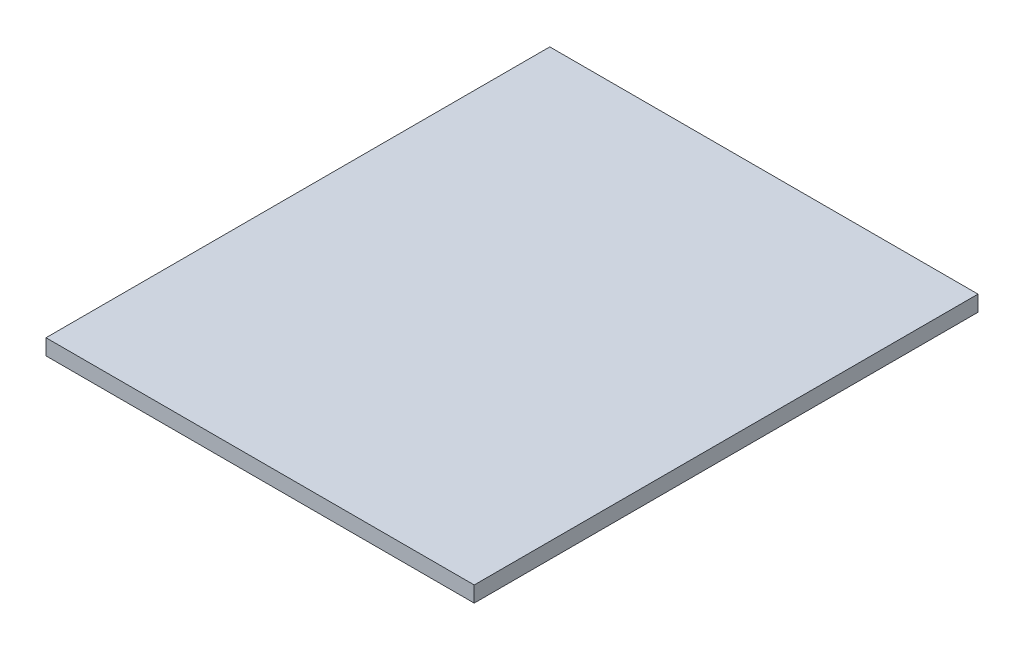
ISO-10303-21;
HEADER;
FILE_DESCRIPTION(('STEP AP214'),'2;1');
FILE_NAME('part.step','',(''),(''),'','','');
FILE_SCHEMA(('AUTOMOTIVE_DESIGN { 1 0 10303 214 1 1 1 1 }'));
ENDSEC;
DATA;
#1=APPLICATION_CONTEXT('core data for automotive mechanical design processes');
#2=APPLICATION_PROTOCOL_DEFINITION('international standard','automotive_design',2000,#1);
#3=PRODUCT_CONTEXT('',#1,'mechanical');
#4=PRODUCT('Part','Part','',(#3));
#5=PRODUCT_RELATED_PRODUCT_CATEGORY('part','',(#4));
#6=PRODUCT_DEFINITION_FORMATION('','',#4);
#7=PRODUCT_DEFINITION_CONTEXT('part definition',#1,'design');
#8=PRODUCT_DEFINITION('design','',#6,#7);
#9=PRODUCT_DEFINITION_SHAPE('','',#8);
#10=(LENGTH_UNIT() NAMED_UNIT(*) SI_UNIT(.MILLI.,.METRE.));
#11=(NAMED_UNIT(*) PLANE_ANGLE_UNIT() SI_UNIT($,.RADIAN.));
#12=(NAMED_UNIT(*) SI_UNIT($,.STERADIAN.) SOLID_ANGLE_UNIT());
#13=UNCERTAINTY_MEASURE_WITH_UNIT(LENGTH_MEASURE(1.E-05),#10,'distance_accuracy_value','');
#14=(GEOMETRIC_REPRESENTATION_CONTEXT(3) GLOBAL_UNCERTAINTY_ASSIGNED_CONTEXT((#13)) GLOBAL_UNIT_ASSIGNED_CONTEXT((#10,
#11,#12)) REPRESENTATION_CONTEXT('',''));
#15=CARTESIAN_POINT('',(0.,0.,0.));
#16=DIRECTION('',(0.,0.,1.));
#17=DIRECTION('',(1.,0.,0.));
#18=AXIS2_PLACEMENT_3D('',#15,#16,#17);
#19=CARTESIAN_POINT('',(43.18,3.175,50.8));
#20=DIRECTION('',(-1.,0.,0.));
#21=DIRECTION('',(0.,0.,1.));
#22=AXIS2_PLACEMENT_3D('',#19,#20,#21);
#23=PLANE('',#22);
#24=DIRECTION('',(0.,0.,-1.));
#25=VECTOR('',#24,1.);
#26=CARTESIAN_POINT('',(43.18,0.,50.8));
#27=LINE('',#26,#25);
#28=CARTESIAN_POINT('',(43.18,0.,50.8));
#29=VERTEX_POINT('',#28);
#30=CARTESIAN_POINT('',(43.18,0.,-50.8));
#31=VERTEX_POINT('',#30);
#32=EDGE_CURVE('E98',#29,#31,#27,.T.);
#33=ORIENTED_EDGE('',*,*,#32,.T.);
#34=DIRECTION('',(0.,-1.,0.));
#35=VECTOR('',#34,1.);
#36=CARTESIAN_POINT('',(43.18,3.175,-50.8));
#37=LINE('',#36,#35);
#38=CARTESIAN_POINT('',(43.18,3.175,-50.8));
#39=VERTEX_POINT('',#38);
#40=EDGE_CURVE('E11',#39,#31,#37,.T.);
#41=ORIENTED_EDGE('',*,*,#40,.F.);
#42=DIRECTION('',(0.,0.,-1.));
#43=VECTOR('',#42,1.);
#44=CARTESIAN_POINT('',(43.18,3.175,50.8));
#45=LINE('',#44,#43);
#46=CARTESIAN_POINT('',(43.18,3.175,50.8));
#47=VERTEX_POINT('',#46);
#48=EDGE_CURVE('E86',#47,#39,#45,.T.);
#49=ORIENTED_EDGE('',*,*,#48,.F.);
#50=DIRECTION('',(0.,-1.,0.));
#51=VECTOR('',#50,1.);
#52=CARTESIAN_POINT('',(43.18,3.175,50.8));
#53=LINE('',#52,#51);
#54=EDGE_CURVE('E94',#47,#29,#53,.T.);
#55=ORIENTED_EDGE('',*,*,#54,.T.);
#56=EDGE_LOOP('',(#33,#41,#49,#55));
#57=FACE_BOUND('',#56,.T.);
#58=ADVANCED_FACE('F35',(#57),#23,.F.);
#59=CARTESIAN_POINT('',(-43.18,3.175,-50.8));
#60=DIRECTION('',(0.,0.,1.));
#61=DIRECTION('',(1.,0.,0.));
#62=AXIS2_PLACEMENT_3D('',#59,#60,#61);
#63=PLANE('',#62);
#64=DIRECTION('',(-1.,0.,0.));
#65=VECTOR('',#64,1.);
#66=CARTESIAN_POINT('',(-43.18,0.,-50.8));
#67=LINE('',#66,#65);
#68=CARTESIAN_POINT('',(-43.18,0.,-50.8));
#69=VERTEX_POINT('',#68);
#70=EDGE_CURVE('E90',#31,#69,#67,.T.);
#71=ORIENTED_EDGE('',*,*,#70,.T.);
#72=DIRECTION('',(0.,-1.,0.));
#73=VECTOR('',#72,1.);
#74=CARTESIAN_POINT('',(-43.18,3.175,-50.8));
#75=LINE('',#74,#73);
#76=CARTESIAN_POINT('',(-43.18,3.175,-50.8));
#77=VERTEX_POINT('',#76);
#78=EDGE_CURVE('E43',#77,#69,#75,.T.);
#79=ORIENTED_EDGE('',*,*,#78,.F.);
#80=DIRECTION('',(-1.,0.,0.));
#81=VECTOR('',#80,1.);
#82=CARTESIAN_POINT('',(-43.18,3.175,-50.8));
#83=LINE('',#82,#81);
#84=EDGE_CURVE('E81',#39,#77,#83,.T.);
#85=ORIENTED_EDGE('',*,*,#84,.F.);
#86=ORIENTED_EDGE('',*,*,#40,.T.);
#87=EDGE_LOOP('',(#71,#79,#85,#86));
#88=FACE_BOUND('',#87,.T.);
#89=ADVANCED_FACE('F89',(#88),#63,.F.);
#90=CARTESIAN_POINT('',(-43.18,3.175,50.8));
#91=DIRECTION('',(1.,0.,0.));
#92=DIRECTION('',(0.,0.,-1.));
#93=AXIS2_PLACEMENT_3D('',#90,#91,#92);
#94=PLANE('',#93);
#95=DIRECTION('',(0.,0.,1.));
#96=VECTOR('',#95,1.);
#97=CARTESIAN_POINT('',(-43.18,0.,50.8));
#98=LINE('',#97,#96);
#99=CARTESIAN_POINT('',(-43.18,0.,50.8));
#100=VERTEX_POINT('',#99);
#101=EDGE_CURVE('E68',#69,#100,#98,.T.);
#102=ORIENTED_EDGE('',*,*,#101,.T.);
#103=DIRECTION('',(0.,-1.,0.));
#104=VECTOR('',#103,1.);
#105=CARTESIAN_POINT('',(-43.18,3.175,50.8));
#106=LINE('',#105,#104);
#107=CARTESIAN_POINT('',(-43.18,3.175,50.8));
#108=VERTEX_POINT('',#107);
#109=EDGE_CURVE('E91',#108,#100,#106,.T.);
#110=ORIENTED_EDGE('',*,*,#109,.F.);
#111=DIRECTION('',(0.,0.,1.));
#112=VECTOR('',#111,1.);
#113=CARTESIAN_POINT('',(-43.18,3.175,50.8));
#114=LINE('',#113,#112);
#115=EDGE_CURVE('E84',#77,#108,#114,.T.);
#116=ORIENTED_EDGE('',*,*,#115,.F.);
#117=ORIENTED_EDGE('',*,*,#78,.T.);
#118=EDGE_LOOP('',(#102,#110,#116,#117));
#119=FACE_BOUND('',#118,.T.);
#120=ADVANCED_FACE('F92',(#119),#94,.F.);
#121=CARTESIAN_POINT('',(-43.18,3.175,50.8));
#122=DIRECTION('',(0.,0.,-1.));
#123=DIRECTION('',(-1.,0.,0.));
#124=AXIS2_PLACEMENT_3D('',#121,#122,#123);
#125=PLANE('',#124);
#126=DIRECTION('',(1.,0.,0.));
#127=VECTOR('',#126,1.);
#128=CARTESIAN_POINT('',(-43.18,0.,50.8));
#129=LINE('',#128,#127);
#130=EDGE_CURVE('E74',#100,#29,#129,.T.);
#131=ORIENTED_EDGE('',*,*,#130,.T.);
#132=ORIENTED_EDGE('',*,*,#54,.F.);
#133=DIRECTION('',(1.,0.,0.));
#134=VECTOR('',#133,1.);
#135=CARTESIAN_POINT('',(-43.18,3.175,50.8));
#136=LINE('',#135,#134);
#137=EDGE_CURVE('E51',#108,#47,#136,.T.);
#138=ORIENTED_EDGE('',*,*,#137,.F.);
#139=ORIENTED_EDGE('',*,*,#109,.T.);
#140=EDGE_LOOP('',(#131,#132,#138,#139));
#141=FACE_BOUND('',#140,.T.);
#142=ADVANCED_FACE('F105',(#141),#125,.F.);
#143=CARTESIAN_POINT('',(0.,3.175,0.));
#144=DIRECTION('',(0.,-1.,0.));
#145=DIRECTION('',(0.,0.,-1.));
#146=AXIS2_PLACEMENT_3D('',#143,#144,#145);
#147=PLANE('',#146);
#148=ORIENTED_EDGE('',*,*,#48,.T.);
#149=ORIENTED_EDGE('',*,*,#84,.T.);
#150=ORIENTED_EDGE('',*,*,#115,.T.);
#151=ORIENTED_EDGE('',*,*,#137,.T.);
#152=EDGE_LOOP('',(#148,#149,#150,#151));
#153=FACE_BOUND('',#152,.T.);
#154=ADVANCED_FACE('F82',(#153),#147,.F.);
#155=CARTESIAN_POINT('',(0.,0.,0.));
#156=DIRECTION('',(0.,-1.,0.));
#157=DIRECTION('',(0.,0.,-1.));
#158=AXIS2_PLACEMENT_3D('',#155,#156,#157);
#159=PLANE('',#158);
#160=ORIENTED_EDGE('',*,*,#32,.F.);
#161=ORIENTED_EDGE('',*,*,#130,.F.);
#162=ORIENTED_EDGE('',*,*,#101,.F.);
#163=ORIENTED_EDGE('',*,*,#70,.F.);
#164=EDGE_LOOP('',(#160,#161,#162,#163));
#165=FACE_BOUND('',#164,.T.);
#166=ADVANCED_FACE('F108',(#165),#159,.T.);
#167=CLOSED_SHELL('',(#58,#89,#120,#142,#154,#166));
#168=MANIFOLD_SOLID_BREP('B2',#167);
#169=ADVANCED_BREP_SHAPE_REPRESENTATION('',(#18,#168),#14);
#170=SHAPE_DEFINITION_REPRESENTATION(#9,#169);
ENDSEC;
END-ISO-10303-21;
